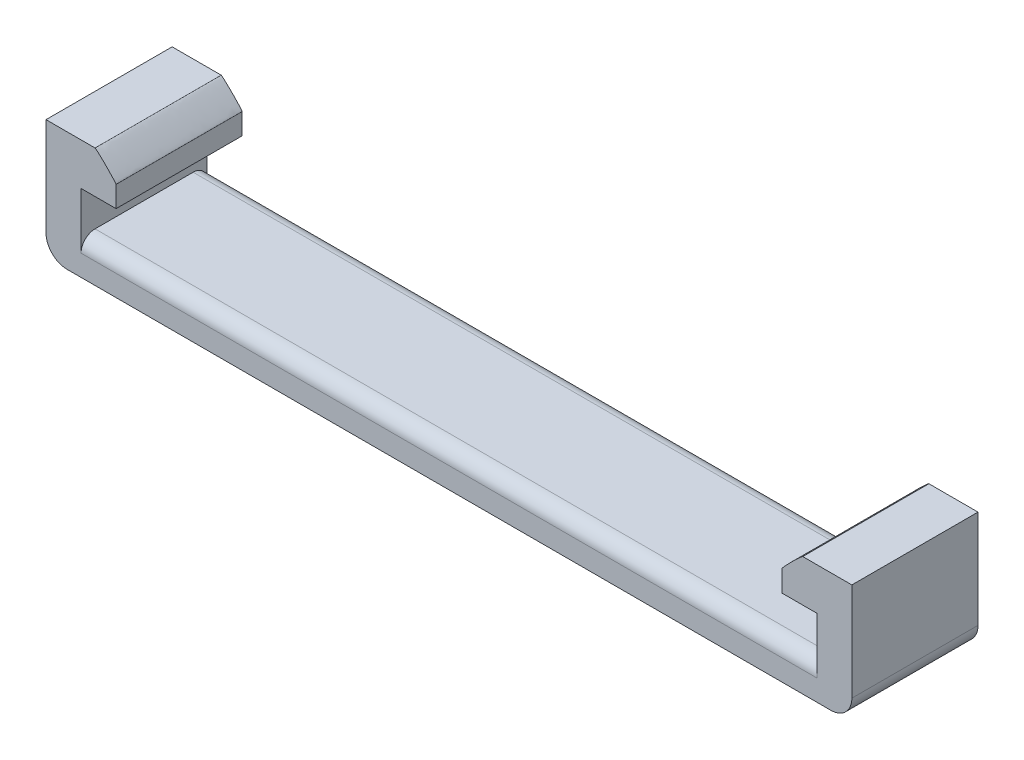
ISO-10303-21;
HEADER;
FILE_DESCRIPTION(('STEP AP214'),'2;1');
FILE_NAME('part.step','',(''),(''),'','','');
FILE_SCHEMA(('AUTOMOTIVE_DESIGN { 1 0 10303 214 1 1 1 1 }'));
ENDSEC;
DATA;
#1=APPLICATION_CONTEXT('core data for automotive mechanical design processes');
#2=APPLICATION_PROTOCOL_DEFINITION('international standard','automotive_design',2000,#1);
#3=PRODUCT_CONTEXT('',#1,'mechanical');
#4=PRODUCT('Part','Part','',(#3));
#5=PRODUCT_RELATED_PRODUCT_CATEGORY('part','',(#4));
#6=PRODUCT_DEFINITION_FORMATION('','',#4);
#7=PRODUCT_DEFINITION_CONTEXT('part definition',#1,'design');
#8=PRODUCT_DEFINITION('design','',#6,#7);
#9=PRODUCT_DEFINITION_SHAPE('','',#8);
#10=(LENGTH_UNIT() NAMED_UNIT(*) SI_UNIT(.MILLI.,.METRE.));
#11=(NAMED_UNIT(*) PLANE_ANGLE_UNIT() SI_UNIT($,.RADIAN.));
#12=(NAMED_UNIT(*) SI_UNIT($,.STERADIAN.) SOLID_ANGLE_UNIT());
#13=UNCERTAINTY_MEASURE_WITH_UNIT(LENGTH_MEASURE(1.E-05),#10,'distance_accuracy_value','');
#14=(GEOMETRIC_REPRESENTATION_CONTEXT(3) GLOBAL_UNCERTAINTY_ASSIGNED_CONTEXT((#13)) GLOBAL_UNIT_ASSIGNED_CONTEXT((#10,
#11,#12)) REPRESENTATION_CONTEXT('',''));
#15=CARTESIAN_POINT('',(0.,0.,0.));
#16=DIRECTION('',(0.,0.,1.));
#17=DIRECTION('',(1.,0.,0.));
#18=AXIS2_PLACEMENT_3D('',#15,#16,#17);
#19=CARTESIAN_POINT('',(0.,1.,0.));
#20=DIRECTION('',(0.,1.,0.));
#21=DIRECTION('',(0.,0.,1.));
#22=AXIS2_PLACEMENT_3D('',#19,#20,#21);
#23=PLANE('',#22);
#24=DIRECTION('',(0.,0.,1.));
#25=VECTOR('',#24,1.);
#26=CARTESIAN_POINT('',(22.,1.,3.6));
#27=LINE('',#26,#25);
#28=CARTESIAN_POINT('',(22.,1.,0.4));
#29=VERTEX_POINT('',#28);
#30=CARTESIAN_POINT('',(22.,1.,3.2));
#31=VERTEX_POINT('',#30);
#32=EDGE_CURVE('E219',#29,#31,#27,.T.);
#33=ORIENTED_EDGE('',*,*,#32,.F.);
#34=DIRECTION('',(-1.,0.,0.));
#35=VECTOR('',#34,1.);
#36=CARTESIAN_POINT('',(1.,1.,0.4));
#37=LINE('',#36,#35);
#38=CARTESIAN_POINT('',(1.,1.,0.4));
#39=VERTEX_POINT('',#38);
#40=EDGE_CURVE('E383',#29,#39,#37,.T.);
#41=ORIENTED_EDGE('',*,*,#40,.T.);
#42=DIRECTION('',(0.,0.,-1.));
#43=VECTOR('',#42,1.);
#44=CARTESIAN_POINT('',(1.,1.,0.));
#45=LINE('',#44,#43);
#46=CARTESIAN_POINT('',(1.,1.,3.2));
#47=VERTEX_POINT('',#46);
#48=EDGE_CURVE('E515',#47,#39,#45,.T.);
#49=ORIENTED_EDGE('',*,*,#48,.F.);
#50=DIRECTION('',(1.,0.,0.));
#51=VECTOR('',#50,1.);
#52=CARTESIAN_POINT('',(22.,1.,3.2));
#53=LINE('',#52,#51);
#54=EDGE_CURVE('E386',#47,#31,#53,.T.);
#55=ORIENTED_EDGE('',*,*,#54,.T.);
#56=EDGE_LOOP('',(#33,#41,#49,#55));
#57=FACE_BOUND('',#56,.T.);
#58=ADVANCED_FACE('F39',(#57),#23,.T.);
#59=CARTESIAN_POINT('',(0.,1.,0.));
#60=DIRECTION('',(1.,0.,0.));
#61=DIRECTION('',(0.,0.,-1.));
#62=AXIS2_PLACEMENT_3D('',#59,#60,#61);
#63=PLANE('',#62);
#64=DIRECTION('',(0.,-1.,0.));
#65=VECTOR('',#64,1.);
#66=CARTESIAN_POINT('',(0.,1.,0.));
#67=LINE('',#66,#65);
#68=CARTESIAN_POINT('',(0.,3.4,0.));
#69=VERTEX_POINT('',#68);
#70=CARTESIAN_POINT('',(0.,0.6,0.));
#71=VERTEX_POINT('',#70);
#72=EDGE_CURVE('E265',#69,#71,#67,.T.);
#73=ORIENTED_EDGE('',*,*,#72,.T.);
#74=DIRECTION('',(0.,0.,1.));
#75=VECTOR('',#74,1.);
#76=CARTESIAN_POINT('',(0.,0.6,0.));
#77=LINE('',#76,#75);
#78=CARTESIAN_POINT('',(0.,0.6,3.6));
#79=VERTEX_POINT('',#78);
#80=EDGE_CURVE('E399',#71,#79,#77,.T.);
#81=ORIENTED_EDGE('',*,*,#80,.T.);
#82=DIRECTION('',(0.,-1.,0.));
#83=VECTOR('',#82,1.);
#84=CARTESIAN_POINT('',(0.,1.,3.6));
#85=LINE('',#84,#83);
#86=CARTESIAN_POINT('',(0.,3.4,3.6));
#87=VERTEX_POINT('',#86);
#88=EDGE_CURVE('E236',#87,#79,#85,.T.);
#89=ORIENTED_EDGE('',*,*,#88,.F.);
#90=DIRECTION('',(0.,0.,1.));
#91=VECTOR('',#90,1.);
#92=CARTESIAN_POINT('',(0.,3.4,0.));
#93=LINE('',#92,#91);
#94=EDGE_CURVE('E426',#69,#87,#93,.T.);
#95=ORIENTED_EDGE('',*,*,#94,.F.);
#96=EDGE_LOOP('',(#73,#81,#89,#95));
#97=FACE_BOUND('',#96,.T.);
#98=ADVANCED_FACE('F300',(#97),#63,.F.);
#99=CARTESIAN_POINT('',(0.,1.,3.6));
#100=DIRECTION('',(0.,0.,-1.));
#101=DIRECTION('',(-1.,0.,0.));
#102=AXIS2_PLACEMENT_3D('',#99,#100,#101);
#103=PLANE('',#102);
#104=DIRECTION('',(0.,-1.,0.));
#105=VECTOR('',#104,1.);
#106=CARTESIAN_POINT('',(22.,3.4,3.6));
#107=LINE('',#106,#105);
#108=CARTESIAN_POINT('',(22.,2.2,3.6));
#109=VERTEX_POINT('',#108);
#110=CARTESIAN_POINT('',(22.,0.6,3.6));
#111=VERTEX_POINT('',#110);
#112=EDGE_CURVE('E54',#109,#111,#107,.T.);
#113=ORIENTED_EDGE('',*,*,#112,.T.);
#114=DIRECTION('',(1.,0.,0.));
#115=VECTOR('',#114,1.);
#116=CARTESIAN_POINT('',(1.,0.6,3.6));
#117=LINE('',#116,#115);
#118=CARTESIAN_POINT('',(1.,0.6,3.6));
#119=VERTEX_POINT('',#118);
#120=EDGE_CURVE('E397',#111,#119,#117,.F.);
#121=ORIENTED_EDGE('',*,*,#120,.T.);
#122=DIRECTION('',(0.,-1.,0.));
#123=VECTOR('',#122,1.);
#124=CARTESIAN_POINT('',(1.,3.4,3.6));
#125=LINE('',#124,#123);
#126=CARTESIAN_POINT('',(1.,2.2,3.6));
#127=VERTEX_POINT('',#126);
#128=EDGE_CURVE('E61',#127,#119,#125,.T.);
#129=ORIENTED_EDGE('',*,*,#128,.F.);
#130=DIRECTION('',(1.,0.,0.));
#131=VECTOR('',#130,1.);
#132=CARTESIAN_POINT('',(1.,2.2,3.6));
#133=LINE('',#132,#131);
#134=CARTESIAN_POINT('',(2.,2.2,3.6));
#135=VERTEX_POINT('',#134);
#136=EDGE_CURVE('E209',#127,#135,#133,.T.);
#137=ORIENTED_EDGE('',*,*,#136,.T.);
#138=DIRECTION('',(0.,1.,0.));
#139=VECTOR('',#138,1.);
#140=CARTESIAN_POINT('',(2.,3.4,3.6));
#141=LINE('',#140,#139);
#142=CARTESIAN_POINT('',(2.,2.8,3.6));
#143=VERTEX_POINT('',#142);
#144=EDGE_CURVE('E204',#135,#143,#141,.T.);
#145=ORIENTED_EDGE('',*,*,#144,.T.);
#146=CARTESIAN_POINT('',(1.4,3.4,3.6));
#147=CARTESIAN_POINT('',(2.,3.4,3.6));
#148=CARTESIAN_POINT('',(2.,2.8,3.6));
#149=(BOUNDED_CURVE() B_SPLINE_CURVE(2,(#146,#147,#148),.UNSPECIFIED.,.F.,
.F.) B_SPLINE_CURVE_WITH_KNOTS((3,3),(0.,1.),
.UNSPECIFIED.) CURVE() GEOMETRIC_REPRESENTATION_ITEM() RATIONAL_B_SPLINE_CURVE((1.,
0.0526315789473684,1.)) REPRESENTATION_ITEM(''));
#150=CARTESIAN_POINT('',(1.4,3.4,3.6));
#151=VERTEX_POINT('',#150);
#152=EDGE_CURVE('E248',#143,#151,#149,.F.);
#153=ORIENTED_EDGE('',*,*,#152,.T.);
#154=DIRECTION('',(1.,0.,0.));
#155=VECTOR('',#154,1.);
#156=CARTESIAN_POINT('',(0.,3.4,3.6));
#157=LINE('',#156,#155);
#158=EDGE_CURVE('E210',#87,#151,#157,.T.);
#159=ORIENTED_EDGE('',*,*,#158,.F.);
#160=ORIENTED_EDGE('',*,*,#88,.T.);
#161=CARTESIAN_POINT('',(0.6,0.6,3.6));
#162=DIRECTION('',(0.,0.,-1.));
#163=DIRECTION('',(-1.,0.,0.));
#164=AXIS2_PLACEMENT_3D('',#161,#162,#163);
#165=CIRCLE('',#164,0.6);
#166=CARTESIAN_POINT('',(0.6,0.,3.6));
#167=VERTEX_POINT('',#166);
#168=EDGE_CURVE('E432',#79,#167,#165,.F.);
#169=ORIENTED_EDGE('',*,*,#168,.T.);
#170=DIRECTION('',(1.,0.,0.));
#171=VECTOR('',#170,1.);
#172=CARTESIAN_POINT('',(0.,0.,3.6));
#173=LINE('',#172,#171);
#174=CARTESIAN_POINT('',(22.4,0.,3.6));
#175=VERTEX_POINT('',#174);
#176=EDGE_CURVE('E409',#167,#175,#173,.T.);
#177=ORIENTED_EDGE('',*,*,#176,.T.);
#178=CARTESIAN_POINT('',(22.4,0.6,3.6));
#179=DIRECTION('',(0.,0.,-1.));
#180=DIRECTION('',(-1.,0.,0.));
#181=AXIS2_PLACEMENT_3D('',#178,#179,#180);
#182=CIRCLE('',#181,0.6);
#183=CARTESIAN_POINT('',(23.,0.6,3.6));
#184=VERTEX_POINT('',#183);
#185=EDGE_CURVE('E257',#175,#184,#182,.F.);
#186=ORIENTED_EDGE('',*,*,#185,.T.);
#187=DIRECTION('',(0.,-1.,0.));
#188=VECTOR('',#187,1.);
#189=CARTESIAN_POINT('',(23.,1.,3.6));
#190=LINE('',#189,#188);
#191=CARTESIAN_POINT('',(23.,3.4,3.6));
#192=VERTEX_POINT('',#191);
#193=EDGE_CURVE('E253',#192,#184,#190,.T.);
#194=ORIENTED_EDGE('',*,*,#193,.F.);
#195=DIRECTION('',(1.,0.,0.));
#196=VECTOR('',#195,1.);
#197=CARTESIAN_POINT('',(23.,3.4,3.6));
#198=LINE('',#197,#196);
#199=CARTESIAN_POINT('',(21.6,3.4,3.6));
#200=VERTEX_POINT('',#199);
#201=EDGE_CURVE('E235',#200,#192,#198,.T.);
#202=ORIENTED_EDGE('',*,*,#201,.F.);
#203=CARTESIAN_POINT('',(21.,2.8,3.6));
#204=CARTESIAN_POINT('',(21.,3.4,3.6));
#205=CARTESIAN_POINT('',(21.6,3.4,3.6));
#206=(BOUNDED_CURVE() B_SPLINE_CURVE(2,(#203,#204,#205),.UNSPECIFIED.,.F.,
.F.) B_SPLINE_CURVE_WITH_KNOTS((3,3),(0.,1.),
.UNSPECIFIED.) CURVE() GEOMETRIC_REPRESENTATION_ITEM() RATIONAL_B_SPLINE_CURVE((1.,
0.0526315789473684,1.)) REPRESENTATION_ITEM(''));
#207=CARTESIAN_POINT('',(21.,2.8,3.6));
#208=VERTEX_POINT('',#207);
#209=EDGE_CURVE('E250',#200,#208,#206,.F.);
#210=ORIENTED_EDGE('',*,*,#209,.T.);
#211=DIRECTION('',(0.,-1.,0.));
#212=VECTOR('',#211,1.);
#213=CARTESIAN_POINT('',(21.,3.4,3.6));
#214=LINE('',#213,#212);
#215=CARTESIAN_POINT('',(21.,2.2,3.6));
#216=VERTEX_POINT('',#215);
#217=EDGE_CURVE('E197',#208,#216,#214,.T.);
#218=ORIENTED_EDGE('',*,*,#217,.T.);
#219=DIRECTION('',(1.,0.,0.));
#220=VECTOR('',#219,1.);
#221=CARTESIAN_POINT('',(22.,2.2,3.6));
#222=LINE('',#221,#220);
#223=EDGE_CURVE('E178',#216,#109,#222,.T.);
#224=ORIENTED_EDGE('',*,*,#223,.T.);
#225=EDGE_LOOP('',(#113,#121,#129,#137,#145,#153,#159,#160,#169,#177,#186,#194,#202,#210,#218,#224));
#226=FACE_BOUND('',#225,.T.);
#227=ADVANCED_FACE('F249',(#226),#103,.F.);
#228=CARTESIAN_POINT('',(23.,1.,0.));
#229=DIRECTION('',(-1.,0.,0.));
#230=DIRECTION('',(0.,0.,1.));
#231=AXIS2_PLACEMENT_3D('',#228,#229,#230);
#232=PLANE('',#231);
#233=ORIENTED_EDGE('',*,*,#193,.T.);
#234=DIRECTION('',(0.,0.,-1.));
#235=VECTOR('',#234,1.);
#236=CARTESIAN_POINT('',(23.,0.6,0.));
#237=LINE('',#236,#235);
#238=CARTESIAN_POINT('',(23.,0.6,0.));
#239=VERTEX_POINT('',#238);
#240=EDGE_CURVE('E264',#184,#239,#237,.T.);
#241=ORIENTED_EDGE('',*,*,#240,.T.);
#242=DIRECTION('',(0.,-1.,0.));
#243=VECTOR('',#242,1.);
#244=CARTESIAN_POINT('',(23.,1.,0.));
#245=LINE('',#244,#243);
#246=CARTESIAN_POINT('',(23.,3.4,0.));
#247=VERTEX_POINT('',#246);
#248=EDGE_CURVE('E261',#247,#239,#245,.T.);
#249=ORIENTED_EDGE('',*,*,#248,.F.);
#250=DIRECTION('',(0.,0.,-1.));
#251=VECTOR('',#250,1.);
#252=CARTESIAN_POINT('',(23.,3.4,3.6));
#253=LINE('',#252,#251);
#254=EDGE_CURVE('E223',#192,#247,#253,.T.);
#255=ORIENTED_EDGE('',*,*,#254,.F.);
#256=EDGE_LOOP('',(#233,#241,#249,#255));
#257=FACE_BOUND('',#256,.T.);
#258=ADVANCED_FACE('F262',(#257),#232,.F.);
#259=CARTESIAN_POINT('',(0.,1.,0.));
#260=DIRECTION('',(0.,0.,1.));
#261=DIRECTION('',(1.,0.,0.));
#262=AXIS2_PLACEMENT_3D('',#259,#260,#261);
#263=PLANE('',#262);
#264=DIRECTION('',(0.,-1.,0.));
#265=VECTOR('',#264,1.);
#266=CARTESIAN_POINT('',(1.,3.4,0.));
#267=LINE('',#266,#265);
#268=CARTESIAN_POINT('',(1.,2.2,0.));
#269=VERTEX_POINT('',#268);
#270=CARTESIAN_POINT('',(1.,0.6,0.));
#271=VERTEX_POINT('',#270);
#272=EDGE_CURVE('E410',#269,#271,#267,.T.);
#273=ORIENTED_EDGE('',*,*,#272,.T.);
#274=DIRECTION('',(-1.,0.,0.));
#275=VECTOR('',#274,1.);
#276=CARTESIAN_POINT('',(22.,0.6,0.));
#277=LINE('',#276,#275);
#278=CARTESIAN_POINT('',(22.,0.6,0.));
#279=VERTEX_POINT('',#278);
#280=EDGE_CURVE('E395',#271,#279,#277,.F.);
#281=ORIENTED_EDGE('',*,*,#280,.T.);
#282=DIRECTION('',(0.,-1.,0.));
#283=VECTOR('',#282,1.);
#284=CARTESIAN_POINT('',(22.,3.4,0.));
#285=LINE('',#284,#283);
#286=CARTESIAN_POINT('',(22.,2.2,0.));
#287=VERTEX_POINT('',#286);
#288=EDGE_CURVE('E188',#287,#279,#285,.T.);
#289=ORIENTED_EDGE('',*,*,#288,.F.);
#290=DIRECTION('',(1.,0.,0.));
#291=VECTOR('',#290,1.);
#292=CARTESIAN_POINT('',(22.,2.2,0.));
#293=LINE('',#292,#291);
#294=CARTESIAN_POINT('',(21.,2.2,0.));
#295=VERTEX_POINT('',#294);
#296=EDGE_CURVE('E177',#295,#287,#293,.T.);
#297=ORIENTED_EDGE('',*,*,#296,.F.);
#298=DIRECTION('',(0.,-1.,0.));
#299=VECTOR('',#298,1.);
#300=CARTESIAN_POINT('',(21.,3.4,0.));
#301=LINE('',#300,#299);
#302=CARTESIAN_POINT('',(21.,2.8,0.));
#303=VERTEX_POINT('',#302);
#304=EDGE_CURVE('E165',#303,#295,#301,.T.);
#305=ORIENTED_EDGE('',*,*,#304,.F.);
#306=CARTESIAN_POINT('',(21.6,3.4,0.));
#307=CARTESIAN_POINT('',(21.,3.4,0.));
#308=CARTESIAN_POINT('',(21.,2.8,0.));
#309=(BOUNDED_CURVE() B_SPLINE_CURVE(2,(#306,#307,#308),.UNSPECIFIED.,.F.,
.F.) B_SPLINE_CURVE_WITH_KNOTS((3,3),(0.,1.),
.UNSPECIFIED.) CURVE() GEOMETRIC_REPRESENTATION_ITEM() RATIONAL_B_SPLINE_CURVE((1.,
0.0526315789473684,1.)) REPRESENTATION_ITEM(''));
#310=CARTESIAN_POINT('',(21.6,3.4,0.));
#311=VERTEX_POINT('',#310);
#312=EDGE_CURVE('E267',#303,#311,#309,.F.);
#313=ORIENTED_EDGE('',*,*,#312,.T.);
#314=DIRECTION('',(-1.,0.,0.));
#315=VECTOR('',#314,1.);
#316=CARTESIAN_POINT('',(23.,3.4,0.));
#317=LINE('',#316,#315);
#318=EDGE_CURVE('E226',#247,#311,#317,.T.);
#319=ORIENTED_EDGE('',*,*,#318,.F.);
#320=ORIENTED_EDGE('',*,*,#248,.T.);
#321=CARTESIAN_POINT('',(22.4,0.6,0.));
#322=DIRECTION('',(0.,0.,1.));
#323=DIRECTION('',(1.,0.,0.));
#324=AXIS2_PLACEMENT_3D('',#321,#322,#323);
#325=CIRCLE('',#324,0.6);
#326=CARTESIAN_POINT('',(22.4,0.,0.));
#327=VERTEX_POINT('',#326);
#328=EDGE_CURVE('E440',#239,#327,#325,.F.);
#329=ORIENTED_EDGE('',*,*,#328,.T.);
#330=DIRECTION('',(-1.,0.,0.));
#331=VECTOR('',#330,1.);
#332=CARTESIAN_POINT('',(0.,0.,0.));
#333=LINE('',#332,#331);
#334=CARTESIAN_POINT('',(0.6,0.,0.));
#335=VERTEX_POINT('',#334);
#336=EDGE_CURVE('E412',#327,#335,#333,.T.);
#337=ORIENTED_EDGE('',*,*,#336,.T.);
#338=CARTESIAN_POINT('',(0.6,0.6,0.));
#339=DIRECTION('',(0.,0.,1.));
#340=DIRECTION('',(1.,0.,0.));
#341=AXIS2_PLACEMENT_3D('',#338,#339,#340);
#342=CIRCLE('',#341,0.6);
#343=EDGE_CURVE('E431',#335,#71,#342,.F.);
#344=ORIENTED_EDGE('',*,*,#343,.T.);
#345=ORIENTED_EDGE('',*,*,#72,.F.);
#346=DIRECTION('',(-1.,0.,0.));
#347=VECTOR('',#346,1.);
#348=CARTESIAN_POINT('',(0.,3.4,0.));
#349=LINE('',#348,#347);
#350=CARTESIAN_POINT('',(1.4,3.4,0.));
#351=VERTEX_POINT('',#350);
#352=EDGE_CURVE('E319',#351,#69,#349,.T.);
#353=ORIENTED_EDGE('',*,*,#352,.F.);
#354=CARTESIAN_POINT('',(2.,2.8,0.));
#355=CARTESIAN_POINT('',(2.,3.4,0.));
#356=CARTESIAN_POINT('',(1.4,3.4,0.));
#357=(BOUNDED_CURVE() B_SPLINE_CURVE(2,(#354,#355,#356),.UNSPECIFIED.,.F.,
.F.) B_SPLINE_CURVE_WITH_KNOTS((3,3),(0.,1.),
.UNSPECIFIED.) CURVE() GEOMETRIC_REPRESENTATION_ITEM() RATIONAL_B_SPLINE_CURVE((1.,
0.0526315789473684,1.)) REPRESENTATION_ITEM(''));
#358=CARTESIAN_POINT('',(2.,2.8,0.));
#359=VERTEX_POINT('',#358);
#360=EDGE_CURVE('E271',#351,#359,#357,.F.);
#361=ORIENTED_EDGE('',*,*,#360,.T.);
#362=DIRECTION('',(0.,1.,0.));
#363=VECTOR('',#362,1.);
#364=CARTESIAN_POINT('',(2.,3.4,0.));
#365=LINE('',#364,#363);
#366=CARTESIAN_POINT('',(2.,2.2,0.));
#367=VERTEX_POINT('',#366);
#368=EDGE_CURVE('E222',#367,#359,#365,.T.);
#369=ORIENTED_EDGE('',*,*,#368,.F.);
#370=DIRECTION('',(1.,0.,0.));
#371=VECTOR('',#370,1.);
#372=CARTESIAN_POINT('',(1.,2.2,0.));
#373=LINE('',#372,#371);
#374=EDGE_CURVE('E208',#269,#367,#373,.T.);
#375=ORIENTED_EDGE('',*,*,#374,.F.);
#376=EDGE_LOOP('',(#273,#281,#289,#297,#305,#313,#319,#320,#329,#337,#344,#345,#353,#361,#369,#375));
#377=FACE_BOUND('',#376,.T.);
#378=ADVANCED_FACE('F186',(#377),#263,.F.);
#379=CARTESIAN_POINT('',(0.,0.,0.));
#380=DIRECTION('',(0.,1.,0.));
#381=DIRECTION('',(0.,0.,1.));
#382=AXIS2_PLACEMENT_3D('',#379,#380,#381);
#383=PLANE('',#382);
#384=ORIENTED_EDGE('',*,*,#336,.F.);
#385=DIRECTION('',(0.,0.,-1.));
#386=VECTOR('',#385,1.);
#387=CARTESIAN_POINT('',(22.4,0.,0.));
#388=LINE('',#387,#386);
#389=EDGE_CURVE('E436',#327,#175,#388,.F.);
#390=ORIENTED_EDGE('',*,*,#389,.T.);
#391=ORIENTED_EDGE('',*,*,#176,.F.);
#392=DIRECTION('',(0.,0.,1.));
#393=VECTOR('',#392,1.);
#394=CARTESIAN_POINT('',(0.6,0.,0.));
#395=LINE('',#394,#393);
#396=EDGE_CURVE('E438',#167,#335,#395,.F.);
#397=ORIENTED_EDGE('',*,*,#396,.T.);
#398=EDGE_LOOP('',(#384,#390,#391,#397));
#399=FACE_BOUND('',#398,.T.);
#400=ADVANCED_FACE('F292',(#399),#383,.F.);
#401=CARTESIAN_POINT('',(1.,3.4,0.));
#402=DIRECTION('',(-1.,0.,0.));
#403=DIRECTION('',(0.,0.,1.));
#404=AXIS2_PLACEMENT_3D('',#401,#402,#403);
#405=PLANE('',#404);
#406=ORIENTED_EDGE('',*,*,#272,.F.);
#407=DIRECTION('',(0.,0.,1.));
#408=VECTOR('',#407,1.);
#409=CARTESIAN_POINT('',(1.,2.2,0.));
#410=LINE('',#409,#408);
#411=EDGE_CURVE('E220',#269,#127,#410,.T.);
#412=ORIENTED_EDGE('',*,*,#411,.T.);
#413=ORIENTED_EDGE('',*,*,#128,.T.);
#414=CARTESIAN_POINT('',(1.,0.6,3.2));
#415=DIRECTION('',(-1.,0.,0.));
#416=DIRECTION('',(0.,0.,1.));
#417=AXIS2_PLACEMENT_3D('',#414,#415,#416);
#418=CIRCLE('',#417,0.4);
#419=EDGE_CURVE('E12',#119,#47,#418,.T.);
#420=ORIENTED_EDGE('',*,*,#419,.T.);
#421=ORIENTED_EDGE('',*,*,#48,.T.);
#422=CARTESIAN_POINT('',(1.,0.6,0.4));
#423=DIRECTION('',(-1.,0.,0.));
#424=DIRECTION('',(0.,0.,1.));
#425=AXIS2_PLACEMENT_3D('',#422,#423,#424);
#426=CIRCLE('',#425,0.4);
#427=EDGE_CURVE('E394',#39,#271,#426,.T.);
#428=ORIENTED_EDGE('',*,*,#427,.T.);
#429=EDGE_LOOP('',(#406,#412,#413,#420,#421,#428));
#430=FACE_BOUND('',#429,.T.);
#431=ADVANCED_FACE('F368',(#430),#405,.F.);
#432=CARTESIAN_POINT('',(0.,3.4,0.));
#433=DIRECTION('',(0.,1.,0.));
#434=DIRECTION('',(0.,0.,1.));
#435=AXIS2_PLACEMENT_3D('',#432,#433,#434);
#436=PLANE('',#435);
#437=ORIENTED_EDGE('',*,*,#158,.T.);
#438=CARTESIAN_POINT('',(1.4,3.4,-0.18));
#439=CARTESIAN_POINT('',(1.4,3.4,1.14));
#440=CARTESIAN_POINT('',(1.4,3.4,2.46));
#441=CARTESIAN_POINT('',(1.4,3.4,3.78));
#442=(BOUNDED_CURVE() B_SPLINE_CURVE(3,(#438,#439,#440,#441),.UNSPECIFIED.,.F.,
.F.) B_SPLINE_CURVE_WITH_KNOTS((4,4),(-0.00018,0.00378),
.UNSPECIFIED.) CURVE() GEOMETRIC_REPRESENTATION_ITEM() RATIONAL_B_SPLINE_CURVE((1.,1.,1.,1.)) REPRESENTATION_ITEM(''));
#443=EDGE_CURVE('E350',#151,#351,#442,.F.);
#444=ORIENTED_EDGE('',*,*,#443,.T.);
#445=ORIENTED_EDGE('',*,*,#352,.T.);
#446=ORIENTED_EDGE('',*,*,#94,.T.);
#447=EDGE_LOOP('',(#437,#444,#445,#446));
#448=FACE_BOUND('',#447,.T.);
#449=ADVANCED_FACE('F357',(#448),#436,.T.);
#450=CARTESIAN_POINT('',(22.,3.4,3.6));
#451=DIRECTION('',(1.,0.,0.));
#452=DIRECTION('',(0.,0.,-1.));
#453=AXIS2_PLACEMENT_3D('',#450,#451,#452);
#454=PLANE('',#453);
#455=ORIENTED_EDGE('',*,*,#112,.F.);
#456=DIRECTION('',(0.,0.,1.));
#457=VECTOR('',#456,1.);
#458=CARTESIAN_POINT('',(22.,2.2,0.));
#459=LINE('',#458,#457);
#460=EDGE_CURVE('E183',#287,#109,#459,.T.);
#461=ORIENTED_EDGE('',*,*,#460,.F.);
#462=ORIENTED_EDGE('',*,*,#288,.T.);
#463=CARTESIAN_POINT('',(22.,0.6,0.4));
#464=DIRECTION('',(1.,0.,0.));
#465=DIRECTION('',(0.,0.,-1.));
#466=AXIS2_PLACEMENT_3D('',#463,#464,#465);
#467=CIRCLE('',#466,0.4);
#468=EDGE_CURVE('E392',#279,#29,#467,.T.);
#469=ORIENTED_EDGE('',*,*,#468,.T.);
#470=ORIENTED_EDGE('',*,*,#32,.T.);
#471=CARTESIAN_POINT('',(22.,0.6,3.2));
#472=DIRECTION('',(1.,0.,0.));
#473=DIRECTION('',(0.,0.,-1.));
#474=AXIS2_PLACEMENT_3D('',#471,#472,#473);
#475=CIRCLE('',#474,0.4);
#476=EDGE_CURVE('E47',#31,#111,#475,.T.);
#477=ORIENTED_EDGE('',*,*,#476,.T.);
#478=EDGE_LOOP('',(#455,#461,#462,#469,#470,#477));
#479=FACE_BOUND('',#478,.T.);
#480=ADVANCED_FACE('F367',(#479),#454,.F.);
#481=CARTESIAN_POINT('',(0.,3.4,0.));
#482=DIRECTION('',(0.,1.,0.));
#483=DIRECTION('',(0.,0.,1.));
#484=AXIS2_PLACEMENT_3D('',#481,#482,#483);
#485=PLANE('',#484);
#486=ORIENTED_EDGE('',*,*,#318,.T.);
#487=CARTESIAN_POINT('',(21.6,3.4,3.78));
#488=CARTESIAN_POINT('',(21.6,3.4,2.46));
#489=CARTESIAN_POINT('',(21.6,3.4,1.14));
#490=CARTESIAN_POINT('',(21.6,3.4,-0.18));
#491=(BOUNDED_CURVE() B_SPLINE_CURVE(3,(#487,#488,#489,#490),.UNSPECIFIED.,.F.,
.F.) B_SPLINE_CURVE_WITH_KNOTS((4,4),(-0.00018,0.00378),
.UNSPECIFIED.) CURVE() GEOMETRIC_REPRESENTATION_ITEM() RATIONAL_B_SPLINE_CURVE((1.,1.,1.,1.)) REPRESENTATION_ITEM(''));
#492=EDGE_CURVE('E241',#311,#200,#491,.F.);
#493=ORIENTED_EDGE('',*,*,#492,.T.);
#494=ORIENTED_EDGE('',*,*,#201,.T.);
#495=ORIENTED_EDGE('',*,*,#254,.T.);
#496=EDGE_LOOP('',(#486,#493,#494,#495));
#497=FACE_BOUND('',#496,.T.);
#498=ADVANCED_FACE('F243',(#497),#485,.T.);
#499=CARTESIAN_POINT('',(2.,3.4,0.));
#500=DIRECTION('',(1.,0.,0.));
#501=DIRECTION('',(0.,1.,0.));
#502=AXIS2_PLACEMENT_3D('',#499,#500,#501);
#503=PLANE('',#502);
#504=ORIENTED_EDGE('',*,*,#368,.T.);
#505=CARTESIAN_POINT('',(2.,2.8,3.78));
#506=CARTESIAN_POINT('',(2.,2.8,2.46));
#507=CARTESIAN_POINT('',(2.,2.8,1.14));
#508=CARTESIAN_POINT('',(2.,2.8,-0.18));
#509=(BOUNDED_CURVE() B_SPLINE_CURVE(3,(#505,#506,#507,#508),.UNSPECIFIED.,.F.,
.F.) B_SPLINE_CURVE_WITH_KNOTS((4,4),(-0.00018,0.00378),
.UNSPECIFIED.) CURVE() GEOMETRIC_REPRESENTATION_ITEM() RATIONAL_B_SPLINE_CURVE((1.,1.,1.,1.)) REPRESENTATION_ITEM(''));
#510=EDGE_CURVE('E270',#359,#143,#509,.F.);
#511=ORIENTED_EDGE('',*,*,#510,.T.);
#512=ORIENTED_EDGE('',*,*,#144,.F.);
#513=DIRECTION('',(0.,0.,1.));
#514=VECTOR('',#513,1.);
#515=CARTESIAN_POINT('',(2.,2.2,0.));
#516=LINE('',#515,#514);
#517=EDGE_CURVE('E217',#367,#135,#516,.T.);
#518=ORIENTED_EDGE('',*,*,#517,.F.);
#519=EDGE_LOOP('',(#504,#511,#512,#518));
#520=FACE_BOUND('',#519,.T.);
#521=ADVANCED_FACE('F332',(#520),#503,.T.);
#522=CARTESIAN_POINT('',(1.,2.2,0.));
#523=DIRECTION('',(0.,-1.,0.));
#524=DIRECTION('',(0.,0.,-1.));
#525=AXIS2_PLACEMENT_3D('',#522,#523,#524);
#526=PLANE('',#525);
#527=ORIENTED_EDGE('',*,*,#136,.F.);
#528=ORIENTED_EDGE('',*,*,#411,.F.);
#529=ORIENTED_EDGE('',*,*,#374,.T.);
#530=ORIENTED_EDGE('',*,*,#517,.T.);
#531=EDGE_LOOP('',(#527,#528,#529,#530));
#532=FACE_BOUND('',#531,.T.);
#533=ADVANCED_FACE('F336',(#532),#526,.T.);
#534=CARTESIAN_POINT('',(22.,2.2,0.));
#535=DIRECTION('',(0.,-1.,0.));
#536=DIRECTION('',(0.,0.,-1.));
#537=AXIS2_PLACEMENT_3D('',#534,#535,#536);
#538=PLANE('',#537);
#539=ORIENTED_EDGE('',*,*,#223,.F.);
#540=DIRECTION('',(0.,0.,1.));
#541=VECTOR('',#540,1.);
#542=CARTESIAN_POINT('',(21.,2.2,0.));
#543=LINE('',#542,#541);
#544=EDGE_CURVE('E169',#295,#216,#543,.T.);
#545=ORIENTED_EDGE('',*,*,#544,.F.);
#546=ORIENTED_EDGE('',*,*,#296,.T.);
#547=ORIENTED_EDGE('',*,*,#460,.T.);
#548=EDGE_LOOP('',(#539,#545,#546,#547));
#549=FACE_BOUND('',#548,.T.);
#550=ADVANCED_FACE('F181',(#549),#538,.T.);
#551=CARTESIAN_POINT('',(21.,3.4,0.));
#552=DIRECTION('',(-1.,0.,0.));
#553=DIRECTION('',(0.,0.,1.));
#554=AXIS2_PLACEMENT_3D('',#551,#552,#553);
#555=PLANE('',#554);
#556=ORIENTED_EDGE('',*,*,#217,.F.);
#557=CARTESIAN_POINT('',(21.,2.8,-0.18));
#558=CARTESIAN_POINT('',(21.,2.8,1.14));
#559=CARTESIAN_POINT('',(21.,2.8,2.46));
#560=CARTESIAN_POINT('',(21.,2.8,3.78));
#561=(BOUNDED_CURVE() B_SPLINE_CURVE(3,(#557,#558,#559,#560),.UNSPECIFIED.,.F.,
.F.) B_SPLINE_CURVE_WITH_KNOTS((4,4),(-0.00018,0.00378),
.UNSPECIFIED.) CURVE() GEOMETRIC_REPRESENTATION_ITEM() RATIONAL_B_SPLINE_CURVE((1.,1.,1.,1.)) REPRESENTATION_ITEM(''));
#562=EDGE_CURVE('E172',#208,#303,#561,.F.);
#563=ORIENTED_EDGE('',*,*,#562,.T.);
#564=ORIENTED_EDGE('',*,*,#304,.T.);
#565=ORIENTED_EDGE('',*,*,#544,.T.);
#566=EDGE_LOOP('',(#556,#563,#564,#565));
#567=FACE_BOUND('',#566,.T.);
#568=ADVANCED_FACE('F168',(#567),#555,.T.);
#569=CARTESIAN_POINT('',(21.6,3.4,-0.18));
#570=CARTESIAN_POINT('',(21.6,3.4,1.14));
#571=CARTESIAN_POINT('',(21.6,3.4,2.46));
#572=CARTESIAN_POINT('',(21.6,3.4,3.78));
#573=CARTESIAN_POINT('',(21.,3.4,-0.18));
#574=CARTESIAN_POINT('',(21.,3.4,1.14));
#575=CARTESIAN_POINT('',(21.,3.4,2.46));
#576=CARTESIAN_POINT('',(21.,3.4,3.78));
#577=CARTESIAN_POINT('',(21.,2.8,-0.18));
#578=CARTESIAN_POINT('',(21.,2.8,1.14));
#579=CARTESIAN_POINT('',(21.,2.8,2.46));
#580=CARTESIAN_POINT('',(21.,2.8,3.78));
#581=(BOUNDED_SURFACE() B_SPLINE_SURFACE(2,3,((#569,#570,#571,#572),(#573,#574,#575,#576),(#577,
#578,#579,#580)),.UNSPECIFIED.,.F.,.F.,.F.) B_SPLINE_SURFACE_WITH_KNOTS((3,3),(4,4),(0.,1.),
(-0.00018,0.00378),
.UNSPECIFIED.) GEOMETRIC_REPRESENTATION_ITEM() RATIONAL_B_SPLINE_SURFACE(((1.,1.,1.,1.),
(0.0526315789473684,0.0526315789473684,0.0526315789473684,0.0526315789473684),(1.,1.,1.,1.))) REPRESENTATION_ITEM('') SURFACE());
#582=ORIENTED_EDGE('',*,*,#312,.F.);
#583=ORIENTED_EDGE('',*,*,#562,.F.);
#584=ORIENTED_EDGE('',*,*,#209,.F.);
#585=ORIENTED_EDGE('',*,*,#492,.F.);
#586=EDGE_LOOP('',(#582,#583,#584,#585));
#587=FACE_BOUND('',#586,.T.);
#588=ADVANCED_FACE('F331',(#587),#581,.T.);
#589=CARTESIAN_POINT('',(2.,2.8,-0.18));
#590=CARTESIAN_POINT('',(2.,2.8,1.14));
#591=CARTESIAN_POINT('',(2.,2.8,2.46));
#592=CARTESIAN_POINT('',(2.,2.8,3.78));
#593=CARTESIAN_POINT('',(2.,3.4,-0.18));
#594=CARTESIAN_POINT('',(2.,3.4,1.14));
#595=CARTESIAN_POINT('',(2.,3.4,2.46));
#596=CARTESIAN_POINT('',(2.,3.4,3.78));
#597=CARTESIAN_POINT('',(1.4,3.4,-0.18));
#598=CARTESIAN_POINT('',(1.4,3.4,1.14));
#599=CARTESIAN_POINT('',(1.4,3.4,2.46));
#600=CARTESIAN_POINT('',(1.4,3.4,3.78));
#601=(BOUNDED_SURFACE() B_SPLINE_SURFACE(2,3,((#589,#590,#591,#592),(#593,#594,#595,#596),(#597,
#598,#599,#600)),.UNSPECIFIED.,.F.,.F.,.F.) B_SPLINE_SURFACE_WITH_KNOTS((3,3),(4,4),(0.,1.),
(-0.00018,0.00378),
.UNSPECIFIED.) GEOMETRIC_REPRESENTATION_ITEM() RATIONAL_B_SPLINE_SURFACE(((1.,1.,1.,1.),
(0.0526315789473684,0.0526315789473684,0.0526315789473684,0.0526315789473684),(1.,1.,1.,1.))) REPRESENTATION_ITEM('') SURFACE());
#602=ORIENTED_EDGE('',*,*,#360,.F.);
#603=ORIENTED_EDGE('',*,*,#443,.F.);
#604=ORIENTED_EDGE('',*,*,#152,.F.);
#605=ORIENTED_EDGE('',*,*,#510,.F.);
#606=EDGE_LOOP('',(#602,#603,#604,#605));
#607=FACE_BOUND('',#606,.T.);
#608=ADVANCED_FACE('F449',(#607),#601,.T.);
#609=CARTESIAN_POINT('',(22.4,0.6,0.));
#610=DIRECTION('',(0.,0.,-1.));
#611=DIRECTION('',(-1.,0.,0.));
#612=AXIS2_PLACEMENT_3D('',#609,#610,#611);
#613=CYLINDRICAL_SURFACE('',#612,0.6);
#614=ORIENTED_EDGE('',*,*,#185,.F.);
#615=ORIENTED_EDGE('',*,*,#389,.F.);
#616=ORIENTED_EDGE('',*,*,#328,.F.);
#617=ORIENTED_EDGE('',*,*,#240,.F.);
#618=EDGE_LOOP('',(#614,#615,#616,#617));
#619=FACE_BOUND('',#618,.T.);
#620=ADVANCED_FACE('F463',(#619),#613,.T.);
#621=CARTESIAN_POINT('',(0.6,0.6,0.));
#622=DIRECTION('',(0.,0.,1.));
#623=DIRECTION('',(1.,0.,0.));
#624=AXIS2_PLACEMENT_3D('',#621,#622,#623);
#625=CYLINDRICAL_SURFACE('',#624,0.6);
#626=ORIENTED_EDGE('',*,*,#343,.F.);
#627=ORIENTED_EDGE('',*,*,#396,.F.);
#628=ORIENTED_EDGE('',*,*,#168,.F.);
#629=ORIENTED_EDGE('',*,*,#80,.F.);
#630=EDGE_LOOP('',(#626,#627,#628,#629));
#631=FACE_BOUND('',#630,.T.);
#632=ADVANCED_FACE('F429',(#631),#625,.T.);
#633=CARTESIAN_POINT('',(0.,0.6,0.4));
#634=DIRECTION('',(1.,0.,0.));
#635=DIRECTION('',(0.,0.,-1.));
#636=AXIS2_PLACEMENT_3D('',#633,#634,#635);
#637=CYLINDRICAL_SURFACE('',#636,0.4);
#638=ORIENTED_EDGE('',*,*,#468,.F.);
#639=ORIENTED_EDGE('',*,*,#280,.F.);
#640=ORIENTED_EDGE('',*,*,#427,.F.);
#641=ORIENTED_EDGE('',*,*,#40,.F.);
#642=EDGE_LOOP('',(#638,#639,#640,#641));
#643=FACE_BOUND('',#642,.T.);
#644=ADVANCED_FACE('F390',(#643),#637,.T.);
#645=CARTESIAN_POINT('',(0.,0.6,3.2));
#646=DIRECTION('',(-1.,0.,0.));
#647=DIRECTION('',(0.,0.,1.));
#648=AXIS2_PLACEMENT_3D('',#645,#646,#647);
#649=CYLINDRICAL_SURFACE('',#648,0.4);
#650=ORIENTED_EDGE('',*,*,#419,.F.);
#651=ORIENTED_EDGE('',*,*,#120,.F.);
#652=ORIENTED_EDGE('',*,*,#476,.F.);
#653=ORIENTED_EDGE('',*,*,#54,.F.);
#654=EDGE_LOOP('',(#650,#651,#652,#653));
#655=FACE_BOUND('',#654,.T.);
#656=ADVANCED_FACE('F41',(#655),#649,.T.);
#657=CLOSED_SHELL('',(#58,#98,#227,#258,#378,#400,#431,#449,#480,#498,#521,#533,#550,#568,#588,
#608,#620,#632,#644,#656));
#658=MANIFOLD_SOLID_BREP('B2',#657);
#659=ADVANCED_BREP_SHAPE_REPRESENTATION('',(#18,#658),#14);
#660=SHAPE_DEFINITION_REPRESENTATION(#9,#659);
ENDSEC;
END-ISO-10303-21;
